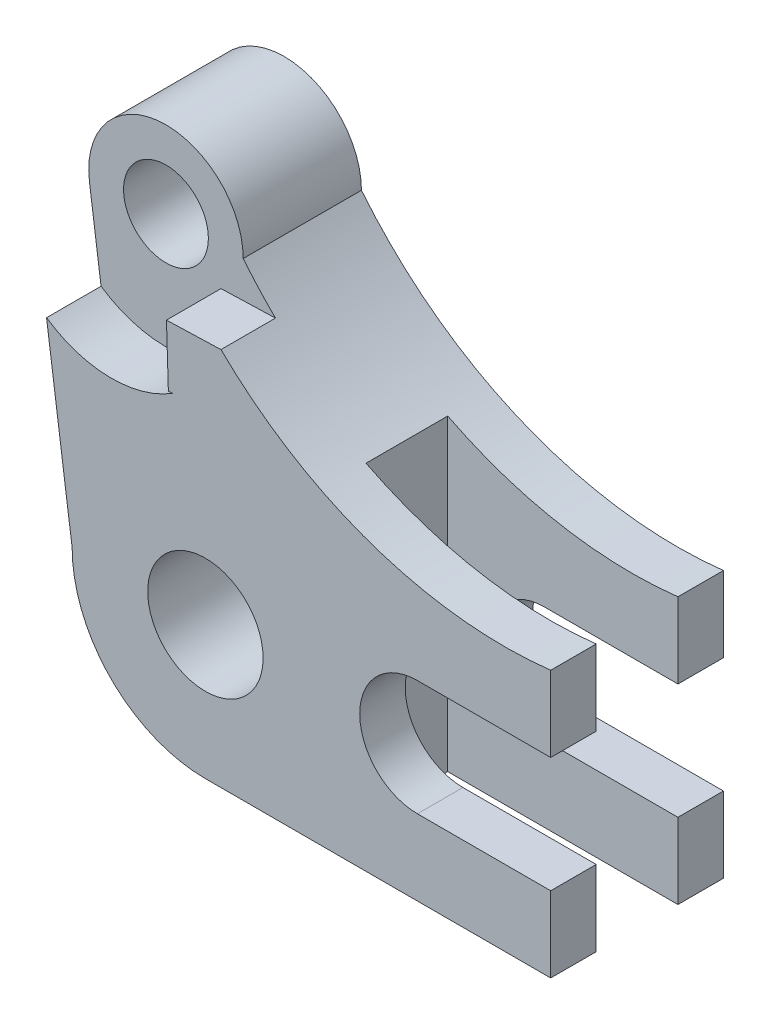
ISO-10303-21;
HEADER;
FILE_DESCRIPTION(('STEP AP214'),'2;1');
FILE_NAME('part.step','',(''),(''),'','','');
FILE_SCHEMA(('AUTOMOTIVE_DESIGN { 1 0 10303 214 1 1 1 1 }'));
ENDSEC;
DATA;
#1=APPLICATION_CONTEXT('core data for automotive mechanical design processes');
#2=APPLICATION_PROTOCOL_DEFINITION('international standard','automotive_design',2000,#1);
#3=PRODUCT_CONTEXT('',#1,'mechanical');
#4=PRODUCT('Part','Part','',(#3));
#5=PRODUCT_RELATED_PRODUCT_CATEGORY('part','',(#4));
#6=PRODUCT_DEFINITION_FORMATION('','',#4);
#7=PRODUCT_DEFINITION_CONTEXT('part definition',#1,'design');
#8=PRODUCT_DEFINITION('design','',#6,#7);
#9=PRODUCT_DEFINITION_SHAPE('','',#8);
#10=(LENGTH_UNIT() NAMED_UNIT(*) SI_UNIT(.MILLI.,.METRE.));
#11=(NAMED_UNIT(*) PLANE_ANGLE_UNIT() SI_UNIT($,.RADIAN.));
#12=(NAMED_UNIT(*) SI_UNIT($,.STERADIAN.) SOLID_ANGLE_UNIT());
#13=UNCERTAINTY_MEASURE_WITH_UNIT(LENGTH_MEASURE(1.E-05),#10,'distance_accuracy_value','');
#14=(GEOMETRIC_REPRESENTATION_CONTEXT(3) GLOBAL_UNCERTAINTY_ASSIGNED_CONTEXT((#13)) GLOBAL_UNIT_ASSIGNED_CONTEXT((#10,
#11,#12)) REPRESENTATION_CONTEXT('',''));
#15=CARTESIAN_POINT('',(0.,0.,0.));
#16=DIRECTION('',(0.,0.,1.));
#17=DIRECTION('',(1.,0.,0.));
#18=AXIS2_PLACEMENT_3D('',#15,#16,#17);
#19=CARTESIAN_POINT('',(57.,-9.52500000000001,28.52));
#20=DIRECTION('',(-1.,0.,0.));
#21=DIRECTION('',(0.,0.,1.));
#22=AXIS2_PLACEMENT_3D('',#19,#20,#21);
#23=PLANE('',#22);
#24=DIRECTION('',(0.,0.,-1.));
#25=VECTOR('',#24,1.);
#26=CARTESIAN_POINT('',(57.,-9.52500000000001,28.52));
#27=LINE('',#26,#25);
#28=CARTESIAN_POINT('',(57.,-9.52500000000001,7.515));
#29=VERTEX_POINT('',#28);
#30=CARTESIAN_POINT('',(57.,-9.52500000000001,0.));
#31=VERTEX_POINT('',#30);
#32=EDGE_CURVE('E307',#29,#31,#27,.T.);
#33=ORIENTED_EDGE('',*,*,#32,.F.);
#34=DIRECTION('',(0.,1.,0.));
#35=VECTOR('',#34,1.);
#36=CARTESIAN_POINT('',(57.,-22.,7.515));
#37=LINE('',#36,#35);
#38=CARTESIAN_POINT('',(57.,-22.,7.515));
#39=VERTEX_POINT('',#38);
#40=EDGE_CURVE('E418',#39,#29,#37,.T.);
#41=ORIENTED_EDGE('',*,*,#40,.F.);
#42=DIRECTION('',(0.,0.,-1.));
#43=VECTOR('',#42,1.);
#44=CARTESIAN_POINT('',(57.,-22.,28.52));
#45=LINE('',#44,#43);
#46=CARTESIAN_POINT('',(57.,-22.,0.));
#47=VERTEX_POINT('',#46);
#48=EDGE_CURVE('E312',#39,#47,#45,.T.);
#49=ORIENTED_EDGE('',*,*,#48,.T.);
#50=DIRECTION('',(0.,1.,0.));
#51=VECTOR('',#50,1.);
#52=CARTESIAN_POINT('',(57.,-9.52500000000001,0.));
#53=LINE('',#52,#51);
#54=EDGE_CURVE('E247',#47,#31,#53,.T.);
#55=ORIENTED_EDGE('',*,*,#54,.T.);
#56=EDGE_LOOP('',(#33,#41,#49,#55));
#57=FACE_BOUND('',#56,.T.);
#58=ADVANCED_FACE('F42',(#57),#23,.F.);
#59=CARTESIAN_POINT('',(35.,-9.52500000000001,28.52));
#60=DIRECTION('',(0.,-1.,0.));
#61=DIRECTION('',(1.,0.,0.));
#62=AXIS2_PLACEMENT_3D('',#59,#60,#61);
#63=PLANE('',#62);
#64=DIRECTION('',(0.,0.,-1.));
#65=VECTOR('',#64,1.);
#66=CARTESIAN_POINT('',(35.,-9.52500000000001,28.52));
#67=LINE('',#66,#65);
#68=CARTESIAN_POINT('',(35.,-9.52500000000001,7.515));
#69=VERTEX_POINT('',#68);
#70=CARTESIAN_POINT('',(35.,-9.52500000000001,0.));
#71=VERTEX_POINT('',#70);
#72=EDGE_CURVE('E302',#69,#71,#67,.T.);
#73=ORIENTED_EDGE('',*,*,#72,.F.);
#74=DIRECTION('',(1.,0.,0.));
#75=VECTOR('',#74,1.);
#76=CARTESIAN_POINT('',(35.,-9.52500000000001,7.515));
#77=LINE('',#76,#75);
#78=EDGE_CURVE('E357',#69,#29,#77,.T.);
#79=ORIENTED_EDGE('',*,*,#78,.T.);
#80=ORIENTED_EDGE('',*,*,#32,.T.);
#81=DIRECTION('',(-1.,0.,0.));
#82=VECTOR('',#81,1.);
#83=CARTESIAN_POINT('',(35.,-9.52500000000001,0.));
#84=LINE('',#83,#82);
#85=EDGE_CURVE('E251',#31,#71,#84,.T.);
#86=ORIENTED_EDGE('',*,*,#85,.T.);
#87=EDGE_LOOP('',(#73,#79,#80,#86));
#88=FACE_BOUND('',#87,.T.);
#89=ADVANCED_FACE('F444',(#88),#63,.F.);
#90=CARTESIAN_POINT('',(35.,0.,28.52));
#91=DIRECTION('',(0.,0.,-1.));
#92=DIRECTION('',(-1.,0.,0.));
#93=AXIS2_PLACEMENT_3D('',#90,#91,#92);
#94=CYLINDRICAL_SURFACE('',#93,9.52500000000001);
#95=DIRECTION('',(0.,0.,-1.));
#96=VECTOR('',#95,1.);
#97=CARTESIAN_POINT('',(35.,9.52500000000001,28.52));
#98=LINE('',#97,#96);
#99=CARTESIAN_POINT('',(35.,9.52500000000001,7.515));
#100=VERTEX_POINT('',#99);
#101=CARTESIAN_POINT('',(35.,9.52500000000001,0.));
#102=VERTEX_POINT('',#101);
#103=EDGE_CURVE('E297',#100,#102,#98,.T.);
#104=ORIENTED_EDGE('',*,*,#103,.F.);
#105=CARTESIAN_POINT('',(35.,0.,7.515));
#106=DIRECTION('',(0.,0.,-1.));
#107=DIRECTION('',(-1.,0.,0.));
#108=AXIS2_PLACEMENT_3D('',#105,#106,#107);
#109=CIRCLE('',#108,9.52500000000001);
#110=EDGE_CURVE('E434',#100,#69,#109,.F.);
#111=ORIENTED_EDGE('',*,*,#110,.T.);
#112=ORIENTED_EDGE('',*,*,#72,.T.);
#113=CARTESIAN_POINT('',(35.,0.,0.));
#114=DIRECTION('',(0.,0.,-1.));
#115=DIRECTION('',(1.,0.,0.));
#116=AXIS2_PLACEMENT_3D('',#113,#114,#115);
#117=CIRCLE('',#116,9.52500000000001);
#118=EDGE_CURVE('E255',#71,#102,#117,.T.);
#119=ORIENTED_EDGE('',*,*,#118,.T.);
#120=EDGE_LOOP('',(#104,#111,#112,#119));
#121=FACE_BOUND('',#120,.T.);
#122=ADVANCED_FACE('F517',(#121),#94,.F.);
#123=CARTESIAN_POINT('',(57.,9.52500000000001,28.52));
#124=DIRECTION('',(0.,1.,0.));
#125=DIRECTION('',(-1.,0.,0.));
#126=AXIS2_PLACEMENT_3D('',#123,#124,#125);
#127=PLANE('',#126);
#128=DIRECTION('',(0.,0.,-1.));
#129=VECTOR('',#128,1.);
#130=CARTESIAN_POINT('',(57.,9.52500000000001,28.52));
#131=LINE('',#130,#129);
#132=CARTESIAN_POINT('',(57.,9.52500000000001,7.515));
#133=VERTEX_POINT('',#132);
#134=CARTESIAN_POINT('',(57.,9.52500000000001,0.));
#135=VERTEX_POINT('',#134);
#136=EDGE_CURVE('E292',#133,#135,#131,.T.);
#137=ORIENTED_EDGE('',*,*,#136,.F.);
#138=DIRECTION('',(-1.,0.,0.));
#139=VECTOR('',#138,1.);
#140=CARTESIAN_POINT('',(57.,9.52500000000001,7.515));
#141=LINE('',#140,#139);
#142=EDGE_CURVE('E431',#133,#100,#141,.T.);
#143=ORIENTED_EDGE('',*,*,#142,.T.);
#144=ORIENTED_EDGE('',*,*,#103,.T.);
#145=DIRECTION('',(1.,0.,0.));
#146=VECTOR('',#145,1.);
#147=CARTESIAN_POINT('',(57.,9.52500000000001,0.));
#148=LINE('',#147,#146);
#149=EDGE_CURVE('E259',#102,#135,#148,.T.);
#150=ORIENTED_EDGE('',*,*,#149,.T.);
#151=EDGE_LOOP('',(#137,#143,#144,#150));
#152=FACE_BOUND('',#151,.T.);
#153=ADVANCED_FACE('F515',(#152),#127,.F.);
#154=CARTESIAN_POINT('',(57.,22.,28.52));
#155=DIRECTION('',(-1.,0.,0.));
#156=DIRECTION('',(0.,0.,1.));
#157=AXIS2_PLACEMENT_3D('',#154,#155,#156);
#158=PLANE('',#157);
#159=DIRECTION('',(0.,0.,-1.));
#160=VECTOR('',#159,1.);
#161=CARTESIAN_POINT('',(57.,22.,28.52));
#162=LINE('',#161,#160);
#163=CARTESIAN_POINT('',(57.,22.,7.515));
#164=VERTEX_POINT('',#163);
#165=CARTESIAN_POINT('',(57.,22.,0.));
#166=VERTEX_POINT('',#165);
#167=EDGE_CURVE('E288',#164,#166,#162,.T.);
#168=ORIENTED_EDGE('',*,*,#167,.F.);
#169=EDGE_CURVE('E414',#133,#164,#37,.T.);
#170=ORIENTED_EDGE('',*,*,#169,.F.);
#171=ORIENTED_EDGE('',*,*,#136,.T.);
#172=DIRECTION('',(0.,1.,0.));
#173=VECTOR('',#172,1.);
#174=CARTESIAN_POINT('',(57.,22.,0.));
#175=LINE('',#174,#173);
#176=EDGE_CURVE('E263',#135,#166,#175,.T.);
#177=ORIENTED_EDGE('',*,*,#176,.T.);
#178=EDGE_LOOP('',(#168,#170,#171,#177));
#179=FACE_BOUND('',#178,.T.);
#180=ADVANCED_FACE('F463',(#179),#158,.F.);
#181=CARTESIAN_POINT('',(-15.5125618415107,46.479677549584,28.52));
#182=DIRECTION('',(0.,0.,-1.));
#183=DIRECTION('',(-1.,0.,0.));
#184=AXIS2_PLACEMENT_3D('',#181,#182,#183);
#185=CYLINDRICAL_SURFACE('',#184,12.75);
#186=CARTESIAN_POINT('',(-15.5125618415107,46.479677549584,19.52));
#187=DIRECTION('',(0.,0.,1.));
#188=DIRECTION('',(1.,0.,0.));
#189=AXIS2_PLACEMENT_3D('',#186,#187,#188);
#190=CIRCLE('',#189,12.75);
#191=CARTESIAN_POINT('',(-2.76256184151075,46.479677549584,19.52));
#192=VERTEX_POINT('',#191);
#193=CARTESIAN_POINT('',(-28.144038020417,44.7452296426915,19.52));
#194=VERTEX_POINT('',#193);
#195=EDGE_CURVE('E352',#192,#194,#190,.T.);
#196=ORIENTED_EDGE('',*,*,#195,.F.);
#197=DIRECTION('',(0.,0.,-1.));
#198=VECTOR('',#197,1.);
#199=CARTESIAN_POINT('',(-2.76256184151073,46.479677549584,28.52));
#200=LINE('',#199,#198);
#201=CARTESIAN_POINT('',(-2.76256184151073,46.479677549584,0.));
#202=VERTEX_POINT('',#201);
#203=EDGE_CURVE('E285',#192,#202,#200,.T.);
#204=ORIENTED_EDGE('',*,*,#203,.T.);
#205=CARTESIAN_POINT('',(-15.5125618415107,46.479677549584,0.));
#206=DIRECTION('',(0.,0.,1.));
#207=DIRECTION('',(1.,0.,0.));
#208=AXIS2_PLACEMENT_3D('',#205,#206,#207);
#209=CIRCLE('',#208,12.75);
#210=CARTESIAN_POINT('',(-28.144038020417,44.7452296426915,0.));
#211=VERTEX_POINT('',#210);
#212=EDGE_CURVE('E271',#202,#211,#209,.T.);
#213=ORIENTED_EDGE('',*,*,#212,.T.);
#214=DIRECTION('',(0.,0.,-1.));
#215=VECTOR('',#214,1.);
#216=CARTESIAN_POINT('',(-28.144038020417,44.7452296426915,28.52));
#217=LINE('',#216,#215);
#218=EDGE_CURVE('E282',#194,#211,#217,.T.);
#219=ORIENTED_EDGE('',*,*,#218,.F.);
#220=EDGE_LOOP('',(#196,#204,#213,#219));
#221=FACE_BOUND('',#220,.T.);
#222=ADVANCED_FACE('F474',(#221),#185,.T.);
#223=CARTESIAN_POINT('',(-15.5125618415107,46.479677549584,28.52));
#224=DIRECTION('',(0.,0.,-1.));
#225=DIRECTION('',(-1.,0.,0.));
#226=AXIS2_PLACEMENT_3D('',#223,#224,#225);
#227=CYLINDRICAL_SURFACE('',#226,7.);
#228=CARTESIAN_POINT('',(-15.5125618415107,46.479677549584,0.));
#229=DIRECTION('',(0.,0.,1.));
#230=DIRECTION('',(1.,0.,0.));
#231=AXIS2_PLACEMENT_3D('',#228,#229,#230);
#232=CIRCLE('',#231,7.);
#233=CARTESIAN_POINT('',(-8.51256184151073,46.479677549584,0.));
#234=VERTEX_POINT('',#233);
#235=EDGE_CURVE('E368',#234,#234,#232,.T.);
#236=ORIENTED_EDGE('',*,*,#235,.F.);
#237=EDGE_LOOP('',(#236));
#238=FACE_BOUND('',#237,.T.);
#239=CARTESIAN_POINT('',(-15.5125618415107,46.479677549584,19.52));
#240=DIRECTION('',(0.,0.,1.));
#241=DIRECTION('',(1.,0.,0.));
#242=AXIS2_PLACEMENT_3D('',#239,#240,#241);
#243=CIRCLE('',#242,7.);
#244=CARTESIAN_POINT('',(-8.51256184151073,46.479677549584,19.52));
#245=VERTEX_POINT('',#244);
#246=EDGE_CURVE('E322',#245,#245,#243,.T.);
#247=ORIENTED_EDGE('',*,*,#246,.T.);
#248=EDGE_LOOP('',(#247));
#249=FACE_BOUND('',#248,.T.);
#250=ADVANCED_FACE('F567',(#238,#249),#227,.F.);
#251=CARTESIAN_POINT('',(0.,0.,28.52));
#252=DIRECTION('',(0.,0.,1.));
#253=DIRECTION('',(1.,0.,0.));
#254=AXIS2_PLACEMENT_3D('',#251,#252,#253);
#255=PLANE('',#254);
#256=DIRECTION('',(0.999504642500105,0.0314717273236879,0.));
#257=VECTOR('',#256,1.);
#258=CARTESIAN_POINT('',(-30.2020079537615,39.5945026828689,28.52));
#259=LINE('',#258,#257);
#260=CARTESIAN_POINT('',(-6.43224301845442,40.3429489919536,28.52));
#261=VERTEX_POINT('',#260);
#262=CARTESIAN_POINT('',(2.56329876404654,40.6261945378668,28.52));
#263=VERTEX_POINT('',#262);
#264=EDGE_CURVE('E198',#261,#263,#259,.T.);
#265=ORIENTED_EDGE('',*,*,#264,.F.);
#266=DIRECTION('',(-0.0314717273236879,0.999504642500105,0.));
#267=VECTOR('',#266,1.);
#268=CARTESIAN_POINT('',(-6.11752574521753,30.3479025669525,28.52));
#269=LINE('',#268,#267);
#270=CARTESIAN_POINT('',(-6.11752574521753,30.3479025669525,28.52));
#271=VERTEX_POINT('',#270);
#272=EDGE_CURVE('E480',#271,#261,#269,.T.);
#273=ORIENTED_EDGE('',*,*,#272,.F.);
#274=DIRECTION('',(0.999504642500105,0.0314717273236879,0.));
#275=VECTOR('',#274,1.);
#276=CARTESIAN_POINT('',(2.87801603728341,30.6311481128657,28.52));
#277=LINE('',#276,#275);
#278=CARTESIAN_POINT('',(-5.44014781059705,30.3692313859965,28.52));
#279=VERTEX_POINT('',#278);
#280=EDGE_CURVE('E479',#271,#279,#277,.T.);
#281=ORIENTED_EDGE('',*,*,#280,.T.);
#282=CARTESIAN_POINT('',(-15.5125618415107,46.479677549584,28.52));
#283=DIRECTION('',(0.,0.,1.));
#284=DIRECTION('',(1.,0.,0.));
#285=AXIS2_PLACEMENT_3D('',#282,#283,#284);
#286=CIRCLE('',#285,19.);
#287=CARTESIAN_POINT('',(-26.2277404485162,30.7893956075674,28.52));
#288=VERTEX_POINT('',#287);
#289=EDGE_CURVE('E344',#288,#279,#286,.T.);
#290=ORIENTED_EDGE('',*,*,#289,.F.);
#291=DIRECTION('',(0.136035129952355,-0.990704014031863,0.));
#292=VECTOR('',#291,1.);
#293=CARTESIAN_POINT('',(-22.,0.,28.52));
#294=LINE('',#293,#292);
#295=CARTESIAN_POINT('',(-22.,0.,28.52));
#296=VERTEX_POINT('',#295);
#297=EDGE_CURVE('E228',#288,#296,#294,.T.);
#298=ORIENTED_EDGE('',*,*,#297,.T.);
#299=CARTESIAN_POINT('',(0.,0.,28.52));
#300=DIRECTION('',(0.,0.,1.));
#301=DIRECTION('',(1.,0.,0.));
#302=AXIS2_PLACEMENT_3D('',#299,#300,#301);
#303=CIRCLE('',#302,22.);
#304=CARTESIAN_POINT('',(0.,-22.,28.52));
#305=VERTEX_POINT('',#304);
#306=EDGE_CURVE('E278',#296,#305,#303,.T.);
#307=ORIENTED_EDGE('',*,*,#306,.T.);
#308=DIRECTION('',(1.,0.,0.));
#309=VECTOR('',#308,1.);
#310=CARTESIAN_POINT('',(57.,-22.,28.52));
#311=LINE('',#310,#309);
#312=CARTESIAN_POINT('',(57.,-22.,28.52));
#313=VERTEX_POINT('',#312);
#314=EDGE_CURVE('E382',#305,#313,#311,.T.);
#315=ORIENTED_EDGE('',*,*,#314,.T.);
#316=DIRECTION('',(0.,1.,0.));
#317=VECTOR('',#316,1.);
#318=CARTESIAN_POINT('',(57.,-9.52500000000001,28.52));
#319=LINE('',#318,#317);
#320=CARTESIAN_POINT('',(57.,-9.52500000000001,28.52));
#321=VERTEX_POINT('',#320);
#322=EDGE_CURVE('E385',#313,#321,#319,.T.);
#323=ORIENTED_EDGE('',*,*,#322,.T.);
#324=DIRECTION('',(-1.,0.,0.));
#325=VECTOR('',#324,1.);
#326=CARTESIAN_POINT('',(35.,-9.52500000000001,28.52));
#327=LINE('',#326,#325);
#328=CARTESIAN_POINT('',(35.,-9.52500000000001,28.52));
#329=VERTEX_POINT('',#328);
#330=EDGE_CURVE('E388',#321,#329,#327,.T.);
#331=ORIENTED_EDGE('',*,*,#330,.T.);
#332=CARTESIAN_POINT('',(35.,0.,28.52));
#333=DIRECTION('',(0.,0.,-1.));
#334=DIRECTION('',(1.,0.,0.));
#335=AXIS2_PLACEMENT_3D('',#332,#333,#334);
#336=CIRCLE('',#335,9.52500000000001);
#337=CARTESIAN_POINT('',(35.,9.52500000000001,28.52));
#338=VERTEX_POINT('',#337);
#339=EDGE_CURVE('E391',#329,#338,#336,.T.);
#340=ORIENTED_EDGE('',*,*,#339,.T.);
#341=DIRECTION('',(1.,0.,0.));
#342=VECTOR('',#341,1.);
#343=CARTESIAN_POINT('',(57.,9.52500000000001,28.52));
#344=LINE('',#343,#342);
#345=CARTESIAN_POINT('',(57.,9.52500000000001,28.52));
#346=VERTEX_POINT('',#345);
#347=EDGE_CURVE('E234',#338,#346,#344,.T.);
#348=ORIENTED_EDGE('',*,*,#347,.T.);
#349=DIRECTION('',(0.,1.,0.));
#350=VECTOR('',#349,1.);
#351=CARTESIAN_POINT('',(57.,22.,28.52));
#352=LINE('',#351,#350);
#353=CARTESIAN_POINT('',(57.,22.,28.52));
#354=VERTEX_POINT('',#353);
#355=EDGE_CURVE('E225',#346,#354,#352,.T.);
#356=ORIENTED_EDGE('',*,*,#355,.T.);
#357=CARTESIAN_POINT('',(49.3708343982134,88.5642233652622,28.52));
#358=DIRECTION('',(0.,0.,-1.));
#359=DIRECTION('',(1.,0.,0.));
#360=AXIS2_PLACEMENT_3D('',#357,#358,#359);
#361=CIRCLE('',#360,67.);
#362=EDGE_CURVE('E215',#354,#263,#361,.T.);
#363=ORIENTED_EDGE('',*,*,#362,.T.);
#364=EDGE_LOOP('',(#265,#273,#281,#290,#298,#307,#315,#323,#331,#340,#348,#356,#363));
#365=FACE_BOUND('',#364,.T.);
#366=CARTESIAN_POINT('',(0.,0.,28.52));
#367=DIRECTION('',(0.,0.,1.));
#368=DIRECTION('',(1.,0.,0.));
#369=AXIS2_PLACEMENT_3D('',#366,#367,#368);
#370=CIRCLE('',#369,9.525);
#371=CARTESIAN_POINT('',(9.525,0.,28.52));
#372=VERTEX_POINT('',#371);
#373=EDGE_CURVE('E243',#372,#372,#370,.T.);
#374=ORIENTED_EDGE('',*,*,#373,.F.);
#375=EDGE_LOOP('',(#374));
#376=FACE_BOUND('',#375,.T.);
#377=ADVANCED_FACE('F222',(#365,#376),#255,.T.);
#378=CARTESIAN_POINT('',(0.,0.,0.));
#379=DIRECTION('',(0.,0.,1.));
#380=DIRECTION('',(1.,0.,0.));
#381=AXIS2_PLACEMENT_3D('',#378,#379,#380);
#382=PLANE('',#381);
#383=CARTESIAN_POINT('',(0.,0.,0.));
#384=DIRECTION('',(0.,0.,1.));
#385=DIRECTION('',(1.,0.,0.));
#386=AXIS2_PLACEMENT_3D('',#383,#384,#385);
#387=CIRCLE('',#386,22.);
#388=CARTESIAN_POINT('',(-22.,0.,0.));
#389=VERTEX_POINT('',#388);
#390=CARTESIAN_POINT('',(0.,-22.,0.));
#391=VERTEX_POINT('',#390);
#392=EDGE_CURVE('E238',#389,#391,#387,.T.);
#393=ORIENTED_EDGE('',*,*,#392,.F.);
#394=DIRECTION('',(0.136035129952355,-0.990704014031863,0.));
#395=VECTOR('',#394,1.);
#396=CARTESIAN_POINT('',(-22.,0.,0.));
#397=LINE('',#396,#395);
#398=EDGE_CURVE('E275',#211,#389,#397,.T.);
#399=ORIENTED_EDGE('',*,*,#398,.F.);
#400=ORIENTED_EDGE('',*,*,#212,.F.);
#401=CARTESIAN_POINT('',(49.3708343982134,88.5642233652622,0.));
#402=DIRECTION('',(0.,0.,-1.));
#403=DIRECTION('',(1.,0.,0.));
#404=AXIS2_PLACEMENT_3D('',#401,#402,#403);
#405=CIRCLE('',#404,67.);
#406=EDGE_CURVE('E267',#166,#202,#405,.T.);
#407=ORIENTED_EDGE('',*,*,#406,.F.);
#408=ORIENTED_EDGE('',*,*,#176,.F.);
#409=ORIENTED_EDGE('',*,*,#149,.F.);
#410=ORIENTED_EDGE('',*,*,#118,.F.);
#411=ORIENTED_EDGE('',*,*,#85,.F.);
#412=ORIENTED_EDGE('',*,*,#54,.F.);
#413=DIRECTION('',(1.,0.,0.));
#414=VECTOR('',#413,1.);
#415=CARTESIAN_POINT('',(57.,-22.,0.));
#416=LINE('',#415,#414);
#417=EDGE_CURVE('E242',#391,#47,#416,.T.);
#418=ORIENTED_EDGE('',*,*,#417,.F.);
#419=EDGE_LOOP('',(#393,#399,#400,#407,#408,#409,#410,#411,#412,#418));
#420=FACE_BOUND('',#419,.T.);
#421=CARTESIAN_POINT('',(0.,0.,0.));
#422=DIRECTION('',(0.,0.,1.));
#423=DIRECTION('',(1.,0.,0.));
#424=AXIS2_PLACEMENT_3D('',#421,#422,#423);
#425=CIRCLE('',#424,9.525);
#426=CARTESIAN_POINT('',(9.525,0.,0.));
#427=VERTEX_POINT('',#426);
#428=EDGE_CURVE('E372',#427,#427,#425,.T.);
#429=ORIENTED_EDGE('',*,*,#428,.T.);
#430=EDGE_LOOP('',(#429));
#431=FACE_BOUND('',#430,.T.);
#432=ORIENTED_EDGE('',*,*,#235,.T.);
#433=EDGE_LOOP('',(#432));
#434=FACE_BOUND('',#433,.T.);
#435=ADVANCED_FACE('F468',(#420,#431,#434),#382,.F.);
#436=CARTESIAN_POINT('',(0.,0.,28.52));
#437=DIRECTION('',(0.,0.,-1.));
#438=DIRECTION('',(-1.,0.,0.));
#439=AXIS2_PLACEMENT_3D('',#436,#437,#438);
#440=CYLINDRICAL_SURFACE('',#439,22.);
#441=ORIENTED_EDGE('',*,*,#392,.T.);
#442=DIRECTION('',(0.,0.,-1.));
#443=VECTOR('',#442,1.);
#444=CARTESIAN_POINT('',(0.,-22.,28.52));
#445=LINE('',#444,#443);
#446=EDGE_CURVE('E317',#305,#391,#445,.T.);
#447=ORIENTED_EDGE('',*,*,#446,.F.);
#448=ORIENTED_EDGE('',*,*,#306,.F.);
#449=DIRECTION('',(0.,0.,-1.));
#450=VECTOR('',#449,1.);
#451=CARTESIAN_POINT('',(-22.,0.,28.52));
#452=LINE('',#451,#450);
#453=EDGE_CURVE('E232',#296,#389,#452,.T.);
#454=ORIENTED_EDGE('',*,*,#453,.T.);
#455=EDGE_LOOP('',(#441,#447,#448,#454));
#456=FACE_BOUND('',#455,.T.);
#457=ADVANCED_FACE('F44',(#456),#440,.T.);
#458=CARTESIAN_POINT('',(57.,-22.,28.52));
#459=DIRECTION('',(0.,1.,0.));
#460=DIRECTION('',(-1.,0.,0.));
#461=AXIS2_PLACEMENT_3D('',#458,#459,#460);
#462=PLANE('',#461);
#463=ORIENTED_EDGE('',*,*,#48,.F.);
#464=DIRECTION('',(-1.,0.,0.));
#465=VECTOR('',#464,1.);
#466=CARTESIAN_POINT('',(19.,-22.,7.515));
#467=LINE('',#466,#465);
#468=CARTESIAN_POINT('',(19.,-22.,7.515));
#469=VERTEX_POINT('',#468);
#470=EDGE_CURVE('E415',#39,#469,#467,.T.);
#471=ORIENTED_EDGE('',*,*,#470,.T.);
#472=DIRECTION('',(0.,0.,1.));
#473=VECTOR('',#472,1.);
#474=CARTESIAN_POINT('',(19.,-22.,7.515));
#475=LINE('',#474,#473);
#476=CARTESIAN_POINT('',(19.,-22.,21.005));
#477=VERTEX_POINT('',#476);
#478=EDGE_CURVE('E495',#469,#477,#475,.T.);
#479=ORIENTED_EDGE('',*,*,#478,.T.);
#480=DIRECTION('',(1.,0.,0.));
#481=VECTOR('',#480,1.);
#482=CARTESIAN_POINT('',(19.,-22.,21.005));
#483=LINE('',#482,#481);
#484=CARTESIAN_POINT('',(57.,-22.,21.005));
#485=VERTEX_POINT('',#484);
#486=EDGE_CURVE('E501',#477,#485,#483,.T.);
#487=ORIENTED_EDGE('',*,*,#486,.T.);
#488=EDGE_CURVE('E313',#313,#485,#45,.T.);
#489=ORIENTED_EDGE('',*,*,#488,.F.);
#490=ORIENTED_EDGE('',*,*,#314,.F.);
#491=ORIENTED_EDGE('',*,*,#446,.T.);
#492=ORIENTED_EDGE('',*,*,#417,.T.);
#493=EDGE_LOOP('',(#463,#471,#479,#487,#489,#490,#491,#492));
#494=FACE_BOUND('',#493,.T.);
#495=ADVANCED_FACE('F536',(#494),#462,.F.);
#496=ORIENTED_EDGE('',*,*,#488,.T.);
#497=DIRECTION('',(0.,1.,0.));
#498=VECTOR('',#497,1.);
#499=CARTESIAN_POINT('',(57.,-22.,21.005));
#500=LINE('',#499,#498);
#501=CARTESIAN_POINT('',(57.,-9.52500000000001,21.005));
#502=VERTEX_POINT('',#501);
#503=EDGE_CURVE('E409',#485,#502,#500,.T.);
#504=ORIENTED_EDGE('',*,*,#503,.T.);
#505=EDGE_CURVE('E308',#321,#502,#27,.T.);
#506=ORIENTED_EDGE('',*,*,#505,.F.);
#507=ORIENTED_EDGE('',*,*,#322,.F.);
#508=EDGE_LOOP('',(#496,#504,#506,#507));
#509=FACE_BOUND('',#508,.T.);
#510=ADVANCED_FACE('F532',(#509),#23,.F.);
#511=ORIENTED_EDGE('',*,*,#505,.T.);
#512=DIRECTION('',(-1.,0.,0.));
#513=VECTOR('',#512,1.);
#514=CARTESIAN_POINT('',(35.,-9.52500000000001,21.005));
#515=LINE('',#514,#513);
#516=CARTESIAN_POINT('',(35.,-9.52500000000001,21.005));
#517=VERTEX_POINT('',#516);
#518=EDGE_CURVE('E427',#502,#517,#515,.T.);
#519=ORIENTED_EDGE('',*,*,#518,.T.);
#520=EDGE_CURVE('E303',#329,#517,#67,.T.);
#521=ORIENTED_EDGE('',*,*,#520,.F.);
#522=ORIENTED_EDGE('',*,*,#330,.F.);
#523=EDGE_LOOP('',(#511,#519,#521,#522));
#524=FACE_BOUND('',#523,.T.);
#525=ADVANCED_FACE('F527',(#524),#63,.F.);
#526=ORIENTED_EDGE('',*,*,#520,.T.);
#527=CARTESIAN_POINT('',(35.,0.,21.005));
#528=DIRECTION('',(0.,0.,1.));
#529=DIRECTION('',(1.,0.,0.));
#530=AXIS2_PLACEMENT_3D('',#527,#528,#529);
#531=CIRCLE('',#530,9.52500000000001);
#532=CARTESIAN_POINT('',(35.,9.52500000000001,21.005));
#533=VERTEX_POINT('',#532);
#534=EDGE_CURVE('E423',#517,#533,#531,.F.);
#535=ORIENTED_EDGE('',*,*,#534,.T.);
#536=EDGE_CURVE('E298',#338,#533,#98,.T.);
#537=ORIENTED_EDGE('',*,*,#536,.F.);
#538=ORIENTED_EDGE('',*,*,#339,.F.);
#539=EDGE_LOOP('',(#526,#535,#537,#538));
#540=FACE_BOUND('',#539,.T.);
#541=ADVANCED_FACE('F520',(#540),#94,.F.);
#542=ORIENTED_EDGE('',*,*,#536,.T.);
#543=DIRECTION('',(1.,0.,0.));
#544=VECTOR('',#543,1.);
#545=CARTESIAN_POINT('',(57.,9.52500000000001,21.005));
#546=LINE('',#545,#544);
#547=CARTESIAN_POINT('',(57.,9.52500000000001,21.005));
#548=VERTEX_POINT('',#547);
#549=EDGE_CURVE('E401',#533,#548,#546,.T.);
#550=ORIENTED_EDGE('',*,*,#549,.T.);
#551=EDGE_CURVE('E293',#346,#548,#131,.T.);
#552=ORIENTED_EDGE('',*,*,#551,.F.);
#553=ORIENTED_EDGE('',*,*,#347,.F.);
#554=EDGE_LOOP('',(#542,#550,#552,#553));
#555=FACE_BOUND('',#554,.T.);
#556=ADVANCED_FACE('F400',(#555),#127,.F.);
#557=ORIENTED_EDGE('',*,*,#551,.T.);
#558=CARTESIAN_POINT('',(57.,22.,21.005));
#559=VERTEX_POINT('',#558);
#560=EDGE_CURVE('E405',#548,#559,#500,.T.);
#561=ORIENTED_EDGE('',*,*,#560,.T.);
#562=EDGE_CURVE('E289',#354,#559,#162,.T.);
#563=ORIENTED_EDGE('',*,*,#562,.F.);
#564=ORIENTED_EDGE('',*,*,#355,.F.);
#565=EDGE_LOOP('',(#557,#561,#563,#564));
#566=FACE_BOUND('',#565,.T.);
#567=ADVANCED_FACE('F404',(#566),#158,.F.);
#568=CARTESIAN_POINT('',(49.3708343982134,88.5642233652622,28.52));
#569=DIRECTION('',(0.,0.,-1.));
#570=DIRECTION('',(-1.,0.,0.));
#571=AXIS2_PLACEMENT_3D('',#568,#569,#570);
#572=CYLINDRICAL_SURFACE('',#571,67.);
#573=DIRECTION('',(0.,0.,-1.));
#574=VECTOR('',#573,1.);
#575=CARTESIAN_POINT('',(19.,28.8431013232552,28.52));
#576=LINE('',#575,#574);
#577=CARTESIAN_POINT('',(19.,28.8431013232552,21.005));
#578=VERTEX_POINT('',#577);
#579=CARTESIAN_POINT('',(19.,28.8431013232552,7.515));
#580=VERTEX_POINT('',#579);
#581=EDGE_CURVE('E329',#578,#580,#576,.T.);
#582=ORIENTED_EDGE('',*,*,#581,.T.);
#583=CARTESIAN_POINT('',(49.3708343982134,88.5642233652622,7.515));
#584=DIRECTION('',(0.,0.,-1.));
#585=DIRECTION('',(-1.,0.,0.));
#586=AXIS2_PLACEMENT_3D('',#583,#584,#585);
#587=CIRCLE('',#586,67.);
#588=EDGE_CURVE('E332',#580,#164,#587,.F.);
#589=ORIENTED_EDGE('',*,*,#588,.T.);
#590=ORIENTED_EDGE('',*,*,#167,.T.);
#591=ORIENTED_EDGE('',*,*,#406,.T.);
#592=ORIENTED_EDGE('',*,*,#203,.F.);
#593=CARTESIAN_POINT('',(49.3708343982134,88.5642233652622,19.52));
#594=DIRECTION('',(0.,0.,1.));
#595=DIRECTION('',(1.,0.,0.));
#596=AXIS2_PLACEMENT_3D('',#593,#594,#595);
#597=CIRCLE('',#596,67.);
#598=CARTESIAN_POINT('',(2.56329876404654,40.6261945378668,19.52));
#599=VERTEX_POINT('',#598);
#600=EDGE_CURVE('E217',#599,#192,#597,.F.);
#601=ORIENTED_EDGE('',*,*,#600,.F.);
#602=DIRECTION('',(0.,0.,1.));
#603=VECTOR('',#602,1.);
#604=CARTESIAN_POINT('',(2.56329876404653,40.6261945378667,19.52));
#605=LINE('',#604,#603);
#606=EDGE_CURVE('E201',#599,#263,#605,.T.);
#607=ORIENTED_EDGE('',*,*,#606,.T.);
#608=ORIENTED_EDGE('',*,*,#362,.F.);
#609=ORIENTED_EDGE('',*,*,#562,.T.);
#610=CARTESIAN_POINT('',(49.3708343982134,88.5642233652622,21.005));
#611=DIRECTION('',(0.,0.,1.));
#612=DIRECTION('',(1.,0.,0.));
#613=AXIS2_PLACEMENT_3D('',#610,#611,#612);
#614=CIRCLE('',#613,67.);
#615=EDGE_CURVE('E321',#559,#578,#614,.F.);
#616=ORIENTED_EDGE('',*,*,#615,.T.);
#617=EDGE_LOOP('',(#582,#589,#590,#591,#592,#601,#607,#608,#609,#616));
#618=FACE_BOUND('',#617,.T.);
#619=ADVANCED_FACE('F213',(#618),#572,.F.);
#620=CARTESIAN_POINT('',(-22.,0.,28.52));
#621=DIRECTION('',(0.990704014031863,0.136035129952355,0.));
#622=DIRECTION('',(-0.136035129952355,0.990704014031863,0.));
#623=AXIS2_PLACEMENT_3D('',#620,#621,#622);
#624=PLANE('',#623);
#625=ORIENTED_EDGE('',*,*,#297,.F.);
#626=DIRECTION('',(0.,0.,1.));
#627=VECTOR('',#626,1.);
#628=CARTESIAN_POINT('',(-26.2277404485162,30.7893956075674,19.52));
#629=LINE('',#628,#627);
#630=CARTESIAN_POINT('',(-26.2277404485162,30.7893956075674,19.52));
#631=VERTEX_POINT('',#630);
#632=EDGE_CURVE('E219',#631,#288,#629,.T.);
#633=ORIENTED_EDGE('',*,*,#632,.F.);
#634=DIRECTION('',(0.136035129952355,-0.990704014031863,0.));
#635=VECTOR('',#634,1.);
#636=CARTESIAN_POINT('',(-28.144038020417,44.7452296426915,19.52));
#637=LINE('',#636,#635);
#638=EDGE_CURVE('E220',#194,#631,#637,.T.);
#639=ORIENTED_EDGE('',*,*,#638,.F.);
#640=ORIENTED_EDGE('',*,*,#218,.T.);
#641=ORIENTED_EDGE('',*,*,#398,.T.);
#642=ORIENTED_EDGE('',*,*,#453,.F.);
#643=EDGE_LOOP('',(#625,#633,#639,#640,#641,#642));
#644=FACE_BOUND('',#643,.T.);
#645=ADVANCED_FACE('F477',(#644),#624,.F.);
#646=CARTESIAN_POINT('',(0.,0.,28.52));
#647=DIRECTION('',(0.,0.,-1.));
#648=DIRECTION('',(-1.,0.,0.));
#649=AXIS2_PLACEMENT_3D('',#646,#647,#648);
#650=CYLINDRICAL_SURFACE('',#649,9.525);
#651=ORIENTED_EDGE('',*,*,#373,.T.);
#652=EDGE_LOOP('',(#651));
#653=FACE_BOUND('',#652,.T.);
#654=ORIENTED_EDGE('',*,*,#428,.F.);
#655=EDGE_LOOP('',(#654));
#656=FACE_BOUND('',#655,.T.);
#657=ADVANCED_FACE('F564',(#653,#656),#650,.F.);
#658=CARTESIAN_POINT('',(-15.5125618415107,46.479677549584,19.52));
#659=DIRECTION('',(0.,0.,1.));
#660=DIRECTION('',(1.,0.,0.));
#661=AXIS2_PLACEMENT_3D('',#658,#659,#660);
#662=PLANE('',#661);
#663=ORIENTED_EDGE('',*,*,#246,.F.);
#664=EDGE_LOOP('',(#663));
#665=FACE_BOUND('',#664,.T.);
#666=ORIENTED_EDGE('',*,*,#195,.T.);
#667=ORIENTED_EDGE('',*,*,#638,.T.);
#668=CARTESIAN_POINT('',(-15.5125618415107,46.479677549584,19.52));
#669=DIRECTION('',(0.,0.,1.));
#670=DIRECTION('',(1.,0.,0.));
#671=AXIS2_PLACEMENT_3D('',#668,#669,#670);
#672=CIRCLE('',#671,19.);
#673=CARTESIAN_POINT('',(-5.44014781059706,30.3692313859965,19.52));
#674=VERTEX_POINT('',#673);
#675=EDGE_CURVE('E341',#631,#674,#672,.T.);
#676=ORIENTED_EDGE('',*,*,#675,.T.);
#677=DIRECTION('',(-0.999504642500105,-0.0314717273236879,0.));
#678=VECTOR('',#677,1.);
#679=CARTESIAN_POINT('',(-6.11752574521753,30.3479025669525,19.52));
#680=LINE('',#679,#678);
#681=CARTESIAN_POINT('',(-6.11752574521753,30.3479025669525,19.52));
#682=VERTEX_POINT('',#681);
#683=EDGE_CURVE('E58',#674,#682,#680,.T.);
#684=ORIENTED_EDGE('',*,*,#683,.T.);
#685=DIRECTION('',(-0.0314717273236879,0.999504642500105,0.));
#686=VECTOR('',#685,1.);
#687=CARTESIAN_POINT('',(-6.11752574521753,30.3479025669525,19.52));
#688=LINE('',#687,#686);
#689=CARTESIAN_POINT('',(-6.43224301845442,40.3429489919536,19.52));
#690=VERTEX_POINT('',#689);
#691=EDGE_CURVE('E492',#682,#690,#688,.T.);
#692=ORIENTED_EDGE('',*,*,#691,.T.);
#693=DIRECTION('',(0.999504642500105,0.0314717273236879,0.));
#694=VECTOR('',#693,1.);
#695=CARTESIAN_POINT('',(-30.2020079537615,39.5945026828689,19.52));
#696=LINE('',#695,#694);
#697=EDGE_CURVE('E208',#690,#599,#696,.T.);
#698=ORIENTED_EDGE('',*,*,#697,.T.);
#699=ORIENTED_EDGE('',*,*,#600,.T.);
#700=EDGE_LOOP('',(#666,#667,#676,#684,#692,#698,#699));
#701=FACE_BOUND('',#700,.T.);
#702=ADVANCED_FACE('F348',(#665,#701),#662,.T.);
#703=CARTESIAN_POINT('',(-15.5125618415107,46.479677549584,19.52));
#704=DIRECTION('',(0.,0.,1.));
#705=DIRECTION('',(1.,0.,0.));
#706=AXIS2_PLACEMENT_3D('',#703,#704,#705);
#707=CYLINDRICAL_SURFACE('',#706,19.);
#708=ORIENTED_EDGE('',*,*,#289,.T.);
#709=DIRECTION('',(0.,0.,1.));
#710=VECTOR('',#709,1.);
#711=CARTESIAN_POINT('',(-5.44014781059706,30.3692313859965,19.52));
#712=LINE('',#711,#710);
#713=EDGE_CURVE('E51',#279,#674,#712,.F.);
#714=ORIENTED_EDGE('',*,*,#713,.T.);
#715=ORIENTED_EDGE('',*,*,#675,.F.);
#716=ORIENTED_EDGE('',*,*,#632,.T.);
#717=EDGE_LOOP('',(#708,#714,#715,#716));
#718=FACE_BOUND('',#717,.T.);
#719=ADVANCED_FACE('F340',(#718),#707,.F.);
#720=CARTESIAN_POINT('',(19.,-22.,7.515));
#721=DIRECTION('',(-1.,0.,0.));
#722=DIRECTION('',(0.,0.,1.));
#723=AXIS2_PLACEMENT_3D('',#720,#721,#722);
#724=PLANE('',#723);
#725=DIRECTION('',(0.,1.,0.));
#726=VECTOR('',#725,1.);
#727=CARTESIAN_POINT('',(19.,-22.,21.005));
#728=LINE('',#727,#726);
#729=EDGE_CURVE('E66',#477,#578,#728,.T.);
#730=ORIENTED_EDGE('',*,*,#729,.F.);
#731=ORIENTED_EDGE('',*,*,#478,.F.);
#732=DIRECTION('',(0.,1.,0.));
#733=VECTOR('',#732,1.);
#734=CARTESIAN_POINT('',(19.,-22.,7.515));
#735=LINE('',#734,#733);
#736=EDGE_CURVE('E424',#469,#580,#735,.T.);
#737=ORIENTED_EDGE('',*,*,#736,.T.);
#738=ORIENTED_EDGE('',*,*,#581,.F.);
#739=EDGE_LOOP('',(#730,#731,#737,#738));
#740=FACE_BOUND('',#739,.T.);
#741=ADVANCED_FACE('F552',(#740),#724,.F.);
#742=CARTESIAN_POINT('',(19.,-22.,7.515));
#743=DIRECTION('',(0.,0.,-1.));
#744=DIRECTION('',(-1.,0.,0.));
#745=AXIS2_PLACEMENT_3D('',#742,#743,#744);
#746=PLANE('',#745);
#747=ORIENTED_EDGE('',*,*,#110,.F.);
#748=ORIENTED_EDGE('',*,*,#142,.F.);
#749=ORIENTED_EDGE('',*,*,#169,.T.);
#750=ORIENTED_EDGE('',*,*,#588,.F.);
#751=ORIENTED_EDGE('',*,*,#736,.F.);
#752=ORIENTED_EDGE('',*,*,#470,.F.);
#753=ORIENTED_EDGE('',*,*,#40,.T.);
#754=ORIENTED_EDGE('',*,*,#78,.F.);
#755=EDGE_LOOP('',(#747,#748,#749,#750,#751,#752,#753,#754));
#756=FACE_BOUND('',#755,.T.);
#757=ADVANCED_FACE('F513',(#756),#746,.F.);
#758=CARTESIAN_POINT('',(19.,-22.,21.005));
#759=DIRECTION('',(0.,0.,1.));
#760=DIRECTION('',(1.,0.,0.));
#761=AXIS2_PLACEMENT_3D('',#758,#759,#760);
#762=PLANE('',#761);
#763=ORIENTED_EDGE('',*,*,#503,.F.);
#764=ORIENTED_EDGE('',*,*,#486,.F.);
#765=ORIENTED_EDGE('',*,*,#729,.T.);
#766=ORIENTED_EDGE('',*,*,#615,.F.);
#767=ORIENTED_EDGE('',*,*,#560,.F.);
#768=ORIENTED_EDGE('',*,*,#549,.F.);
#769=ORIENTED_EDGE('',*,*,#534,.F.);
#770=ORIENTED_EDGE('',*,*,#518,.F.);
#771=EDGE_LOOP('',(#763,#764,#765,#766,#767,#768,#769,#770));
#772=FACE_BOUND('',#771,.T.);
#773=ADVANCED_FACE('F406',(#772),#762,.F.);
#774=CARTESIAN_POINT('',(-0.96068702143657,30.5102776228213,0.));
#775=DIRECTION('',(0.0314717273236879,-0.999504642500106,0.));
#776=DIRECTION('',(0.999504642500106,0.0314717273236879,0.));
#777=AXIS2_PLACEMENT_3D('',#774,#775,#776);
#778=PLANE('',#777);
#779=ORIENTED_EDGE('',*,*,#713,.F.);
#780=ORIENTED_EDGE('',*,*,#280,.F.);
#781=DIRECTION('',(0.,0.,1.));
#782=VECTOR('',#781,1.);
#783=CARTESIAN_POINT('',(-6.11752574521753,30.3479025669525,28.52));
#784=LINE('',#783,#782);
#785=EDGE_CURVE('E486',#682,#271,#784,.T.);
#786=ORIENTED_EDGE('',*,*,#785,.F.);
#787=ORIENTED_EDGE('',*,*,#683,.F.);
#788=EDGE_LOOP('',(#779,#780,#786,#787));
#789=FACE_BOUND('',#788,.T.);
#790=ADVANCED_FACE('F630',(#789),#778,.T.);
#791=CARTESIAN_POINT('',(-6.11752574521753,30.3479025669525,28.52));
#792=DIRECTION('',(-0.999504642500105,-0.0314717273236879,0.));
#793=DIRECTION('',(0.0314717273236879,-0.999504642500105,0.));
#794=AXIS2_PLACEMENT_3D('',#791,#792,#793);
#795=PLANE('',#794);
#796=DIRECTION('',(0.,0.,1.));
#797=VECTOR('',#796,1.);
#798=CARTESIAN_POINT('',(-6.43224301845441,40.3429489919536,28.52));
#799=LINE('',#798,#797);
#800=EDGE_CURVE('E11',#690,#261,#799,.T.);
#801=ORIENTED_EDGE('',*,*,#800,.F.);
#802=ORIENTED_EDGE('',*,*,#691,.F.);
#803=ORIENTED_EDGE('',*,*,#785,.T.);
#804=ORIENTED_EDGE('',*,*,#272,.T.);
#805=EDGE_LOOP('',(#801,#802,#803,#804));
#806=FACE_BOUND('',#805,.T.);
#807=ADVANCED_FACE('F635',(#806),#795,.T.);
#808=CARTESIAN_POINT('',(-30.2020079537615,39.5945026828689,19.52));
#809=DIRECTION('',(0.0314717273236879,-0.999504642500105,0.));
#810=DIRECTION('',(0.999504642500106,0.0314717273236879,0.));
#811=AXIS2_PLACEMENT_3D('',#808,#809,#810);
#812=PLANE('',#811);
#813=ORIENTED_EDGE('',*,*,#800,.T.);
#814=ORIENTED_EDGE('',*,*,#264,.T.);
#815=ORIENTED_EDGE('',*,*,#606,.F.);
#816=ORIENTED_EDGE('',*,*,#697,.F.);
#817=EDGE_LOOP('',(#813,#814,#815,#816));
#818=FACE_BOUND('',#817,.T.);
#819=ADVANCED_FACE('F200',(#818),#812,.F.);
#820=CLOSED_SHELL('',(#58,#89,#122,#153,#180,#222,#250,#377,#435,#457,#495,#510,#525,#541,#556,
#567,#619,#645,#657,#702,#719,#741,#757,#773,#790,#807,#819));
#821=MANIFOLD_SOLID_BREP('B2',#820);
#822=ADVANCED_BREP_SHAPE_REPRESENTATION('',(#18,#821),#14);
#823=SHAPE_DEFINITION_REPRESENTATION(#9,#822);
ENDSEC;
END-ISO-10303-21;
